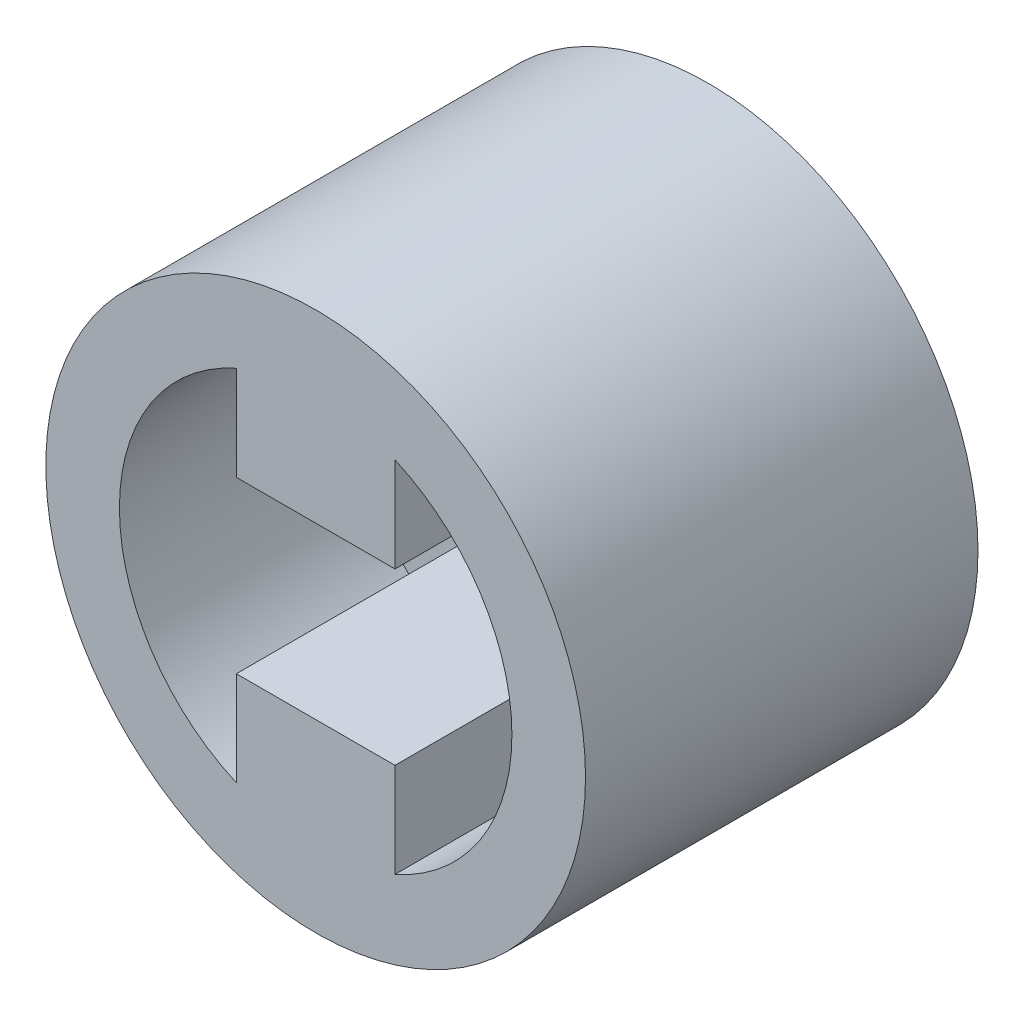
ISO-10303-21;
HEADER;
FILE_DESCRIPTION(('STEP AP214'),'2;1');
FILE_NAME('part.step','',(''),(''),'','','');
FILE_SCHEMA(('AUTOMOTIVE_DESIGN { 1 0 10303 214 1 1 1 1 }'));
ENDSEC;
DATA;
#1=APPLICATION_CONTEXT('core data for automotive mechanical design processes');
#2=APPLICATION_PROTOCOL_DEFINITION('international standard','automotive_design',2000,#1);
#3=PRODUCT_CONTEXT('',#1,'mechanical');
#4=PRODUCT('Part','Part','',(#3));
#5=PRODUCT_RELATED_PRODUCT_CATEGORY('part','',(#4));
#6=PRODUCT_DEFINITION_FORMATION('','',#4);
#7=PRODUCT_DEFINITION_CONTEXT('part definition',#1,'design');
#8=PRODUCT_DEFINITION('design','',#6,#7);
#9=PRODUCT_DEFINITION_SHAPE('','',#8);
#10=(LENGTH_UNIT() NAMED_UNIT(*) SI_UNIT(.MILLI.,.METRE.));
#11=(NAMED_UNIT(*) PLANE_ANGLE_UNIT() SI_UNIT($,.RADIAN.));
#12=(NAMED_UNIT(*) SI_UNIT($,.STERADIAN.) SOLID_ANGLE_UNIT());
#13=UNCERTAINTY_MEASURE_WITH_UNIT(LENGTH_MEASURE(1.E-05),#10,'distance_accuracy_value','');
#14=(GEOMETRIC_REPRESENTATION_CONTEXT(3) GLOBAL_UNCERTAINTY_ASSIGNED_CONTEXT((#13)) GLOBAL_UNIT_ASSIGNED_CONTEXT((#10,
#11,#12)) REPRESENTATION_CONTEXT('',''));
#15=CARTESIAN_POINT('',(0.,0.,0.));
#16=DIRECTION('',(0.,0.,1.));
#17=DIRECTION('',(1.,0.,0.));
#18=AXIS2_PLACEMENT_3D('',#15,#16,#17);
#19=CARTESIAN_POINT('',(0.,0.,12.));
#20=DIRECTION('',(0.,0.,1.));
#21=DIRECTION('',(1.,0.,0.));
#22=AXIS2_PLACEMENT_3D('',#19,#20,#21);
#23=PLANE('',#22);
#24=CARTESIAN_POINT('',(0.,0.,12.));
#25=DIRECTION('',(0.,0.,1.));
#26=DIRECTION('',(1.,0.,0.));
#27=AXIS2_PLACEMENT_3D('',#24,#25,#26);
#28=CIRCLE('',#27,8.25);
#29=CARTESIAN_POINT('',(8.25,0.,12.));
#30=VERTEX_POINT('',#29);
#31=EDGE_CURVE('E239',#30,#30,#28,.T.);
#32=ORIENTED_EDGE('',*,*,#31,.T.);
#33=EDGE_LOOP('',(#32));
#34=FACE_BOUND('',#33,.T.);
#35=CARTESIAN_POINT('',(0.,0.,12.));
#36=DIRECTION('',(0.,0.,1.));
#37=DIRECTION('',(1.,0.,0.));
#38=AXIS2_PLACEMENT_3D('',#35,#36,#37);
#39=CIRCLE('',#38,6.);
#40=CARTESIAN_POINT('',(-2.425,5.48811215264411,12.));
#41=VERTEX_POINT('',#40);
#42=CARTESIAN_POINT('',(-2.425,-5.48811215264411,12.));
#43=VERTEX_POINT('',#42);
#44=EDGE_CURVE('E203',#41,#43,#39,.T.);
#45=ORIENTED_EDGE('',*,*,#44,.F.);
#46=DIRECTION('',(0.,-1.,0.));
#47=VECTOR('',#46,1.);
#48=CARTESIAN_POINT('',(-2.425,0.,12.));
#49=LINE('',#48,#47);
#50=CARTESIAN_POINT('',(-2.425,2.6,12.));
#51=VERTEX_POINT('',#50);
#52=EDGE_CURVE('E172',#41,#51,#49,.T.);
#53=ORIENTED_EDGE('',*,*,#52,.T.);
#54=DIRECTION('',(1.,0.,0.));
#55=VECTOR('',#54,1.);
#56=CARTESIAN_POINT('',(0.,2.6,12.));
#57=LINE('',#56,#55);
#58=CARTESIAN_POINT('',(2.425,2.6,12.));
#59=VERTEX_POINT('',#58);
#60=EDGE_CURVE('E183',#51,#59,#57,.T.);
#61=ORIENTED_EDGE('',*,*,#60,.T.);
#62=DIRECTION('',(0.,-1.,0.));
#63=VECTOR('',#62,1.);
#64=CARTESIAN_POINT('',(2.425,0.,12.));
#65=LINE('',#64,#63);
#66=CARTESIAN_POINT('',(2.425,5.48811215264411,12.));
#67=VERTEX_POINT('',#66);
#68=EDGE_CURVE('E216',#67,#59,#65,.T.);
#69=ORIENTED_EDGE('',*,*,#68,.F.);
#70=CARTESIAN_POINT('',(2.425,-5.48811215264411,12.));
#71=VERTEX_POINT('',#70);
#72=EDGE_CURVE('E207',#71,#67,#39,.T.);
#73=ORIENTED_EDGE('',*,*,#72,.F.);
#74=DIRECTION('',(0.,-1.,0.));
#75=VECTOR('',#74,1.);
#76=CARTESIAN_POINT('',(2.425,0.,12.));
#77=LINE('',#76,#75);
#78=CARTESIAN_POINT('',(2.425,-2.6,12.));
#79=VERTEX_POINT('',#78);
#80=EDGE_CURVE('E213',#79,#71,#77,.T.);
#81=ORIENTED_EDGE('',*,*,#80,.F.);
#82=DIRECTION('',(1.,0.,0.));
#83=VECTOR('',#82,1.);
#84=CARTESIAN_POINT('',(0.,-2.6,12.));
#85=LINE('',#84,#83);
#86=CARTESIAN_POINT('',(-2.425,-2.6,12.));
#87=VERTEX_POINT('',#86);
#88=EDGE_CURVE('E210',#87,#79,#85,.T.);
#89=ORIENTED_EDGE('',*,*,#88,.F.);
#90=DIRECTION('',(0.,-1.,0.));
#91=VECTOR('',#90,1.);
#92=CARTESIAN_POINT('',(-2.425,0.,12.));
#93=LINE('',#92,#91);
#94=EDGE_CURVE('E206',#87,#43,#93,.T.);
#95=ORIENTED_EDGE('',*,*,#94,.T.);
#96=EDGE_LOOP('',(#45,#53,#61,#69,#73,#81,#89,#95));
#97=FACE_BOUND('',#96,.T.);
#98=ADVANCED_FACE('F39',(#34,#97),#23,.T.);
#99=CARTESIAN_POINT('',(0.,0.,12.));
#100=DIRECTION('',(0.,0.,-1.));
#101=DIRECTION('',(-1.,0.,0.));
#102=AXIS2_PLACEMENT_3D('',#99,#100,#101);
#103=CYLINDRICAL_SURFACE('',#102,8.25);
#104=ORIENTED_EDGE('',*,*,#31,.F.);
#105=EDGE_LOOP('',(#104));
#106=FACE_BOUND('',#105,.T.);
#107=CARTESIAN_POINT('',(0.,0.,0.));
#108=DIRECTION('',(0.,0.,1.));
#109=DIRECTION('',(1.,0.,0.));
#110=AXIS2_PLACEMENT_3D('',#107,#108,#109);
#111=CIRCLE('',#110,8.25);
#112=CARTESIAN_POINT('',(8.25,0.,0.));
#113=VERTEX_POINT('',#112);
#114=EDGE_CURVE('E224',#113,#113,#111,.T.);
#115=ORIENTED_EDGE('',*,*,#114,.T.);
#116=EDGE_LOOP('',(#115));
#117=FACE_BOUND('',#116,.T.);
#118=ADVANCED_FACE('F41',(#106,#117),#103,.T.);
#119=CARTESIAN_POINT('',(0.,0.,0.));
#120=DIRECTION('',(0.,0.,1.));
#121=DIRECTION('',(1.,0.,0.));
#122=AXIS2_PLACEMENT_3D('',#119,#120,#121);
#123=PLANE('',#122);
#124=DIRECTION('',(0.5,0.866025403784439,0.));
#125=VECTOR('',#124,1.);
#126=CARTESIAN_POINT('',(-2.3094010767585,0.,0.));
#127=LINE('',#126,#125);
#128=CARTESIAN_POINT('',(-2.3094010767585,0.,0.));
#129=VERTEX_POINT('',#128);
#130=CARTESIAN_POINT('',(-1.15470053837925,2.,0.));
#131=VERTEX_POINT('',#130);
#132=EDGE_CURVE('E151',#129,#131,#127,.T.);
#133=ORIENTED_EDGE('',*,*,#132,.F.);
#134=DIRECTION('',(-0.5,0.866025403784439,0.));
#135=VECTOR('',#134,1.);
#136=CARTESIAN_POINT('',(-1.15470053837925,-2.,0.));
#137=LINE('',#136,#135);
#138=CARTESIAN_POINT('',(-1.15470053837925,-2.,0.));
#139=VERTEX_POINT('',#138);
#140=EDGE_CURVE('E54',#139,#129,#137,.T.);
#141=ORIENTED_EDGE('',*,*,#140,.F.);
#142=DIRECTION('',(-1.,0.,0.));
#143=VECTOR('',#142,1.);
#144=CARTESIAN_POINT('',(1.15470053837925,-2.,0.));
#145=LINE('',#144,#143);
#146=CARTESIAN_POINT('',(1.15470053837925,-2.,0.));
#147=VERTEX_POINT('',#146);
#148=EDGE_CURVE('E167',#147,#139,#145,.T.);
#149=ORIENTED_EDGE('',*,*,#148,.F.);
#150=DIRECTION('',(-0.5,-0.866025403784439,0.));
#151=VECTOR('',#150,1.);
#152=CARTESIAN_POINT('',(2.3094010767585,0.,0.));
#153=LINE('',#152,#151);
#154=CARTESIAN_POINT('',(2.3094010767585,0.,0.));
#155=VERTEX_POINT('',#154);
#156=EDGE_CURVE('E161',#155,#147,#153,.T.);
#157=ORIENTED_EDGE('',*,*,#156,.F.);
#158=DIRECTION('',(0.5,-0.866025403784439,0.));
#159=VECTOR('',#158,1.);
#160=CARTESIAN_POINT('',(1.15470053837925,2.,0.));
#161=LINE('',#160,#159);
#162=CARTESIAN_POINT('',(1.15470053837925,2.,0.));
#163=VERTEX_POINT('',#162);
#164=EDGE_CURVE('E159',#163,#155,#161,.T.);
#165=ORIENTED_EDGE('',*,*,#164,.F.);
#166=DIRECTION('',(1.,0.,0.));
#167=VECTOR('',#166,1.);
#168=CARTESIAN_POINT('',(-1.15470053837925,2.,0.));
#169=LINE('',#168,#167);
#170=EDGE_CURVE('E142',#131,#163,#169,.T.);
#171=ORIENTED_EDGE('',*,*,#170,.F.);
#172=EDGE_LOOP('',(#133,#141,#149,#157,#165,#171));
#173=FACE_BOUND('',#172,.T.);
#174=ORIENTED_EDGE('',*,*,#114,.F.);
#175=EDGE_LOOP('',(#174));
#176=FACE_BOUND('',#175,.T.);
#177=ADVANCED_FACE('F155',(#173,#176),#123,.F.);
#178=CARTESIAN_POINT('',(-2.425,0.,5.));
#179=DIRECTION('',(-1.,0.,0.));
#180=DIRECTION('',(0.,0.,1.));
#181=AXIS2_PLACEMENT_3D('',#178,#179,#180);
#182=PLANE('',#181);
#183=ORIENTED_EDGE('',*,*,#52,.F.);
#184=DIRECTION('',(0.,0.,1.));
#185=VECTOR('',#184,1.);
#186=CARTESIAN_POINT('',(-2.425,5.48811215264411,5.));
#187=LINE('',#186,#185);
#188=CARTESIAN_POINT('',(-2.425,5.48811215264411,5.));
#189=VERTEX_POINT('',#188);
#190=EDGE_CURVE('E200',#189,#41,#187,.T.);
#191=ORIENTED_EDGE('',*,*,#190,.F.);
#192=DIRECTION('',(0.,-1.,0.));
#193=VECTOR('',#192,1.);
#194=CARTESIAN_POINT('',(-2.425,0.,5.));
#195=LINE('',#194,#193);
#196=CARTESIAN_POINT('',(-2.425,2.6,5.));
#197=VERTEX_POINT('',#196);
#198=EDGE_CURVE('E179',#189,#197,#195,.T.);
#199=ORIENTED_EDGE('',*,*,#198,.T.);
#200=DIRECTION('',(0.,0.,1.));
#201=VECTOR('',#200,1.);
#202=CARTESIAN_POINT('',(-2.425,2.6,5.));
#203=LINE('',#202,#201);
#204=EDGE_CURVE('E221',#197,#51,#203,.T.);
#205=ORIENTED_EDGE('',*,*,#204,.T.);
#206=EDGE_LOOP('',(#183,#191,#199,#205));
#207=FACE_BOUND('',#206,.T.);
#208=ADVANCED_FACE('F285',(#207),#182,.T.);
#209=CARTESIAN_POINT('',(0.,2.6,5.));
#210=DIRECTION('',(0.,-1.,0.));
#211=DIRECTION('',(0.,0.,-1.));
#212=AXIS2_PLACEMENT_3D('',#209,#210,#211);
#213=PLANE('',#212);
#214=ORIENTED_EDGE('',*,*,#60,.F.);
#215=ORIENTED_EDGE('',*,*,#204,.F.);
#216=DIRECTION('',(1.,0.,0.));
#217=VECTOR('',#216,1.);
#218=CARTESIAN_POINT('',(0.,2.6,5.));
#219=LINE('',#218,#217);
#220=CARTESIAN_POINT('',(2.425,2.6,5.));
#221=VERTEX_POINT('',#220);
#222=EDGE_CURVE('E198',#197,#221,#219,.T.);
#223=ORIENTED_EDGE('',*,*,#222,.T.);
#224=DIRECTION('',(0.,0.,1.));
#225=VECTOR('',#224,1.);
#226=CARTESIAN_POINT('',(2.425,2.6,5.));
#227=LINE('',#226,#225);
#228=EDGE_CURVE('E225',#221,#59,#227,.T.);
#229=ORIENTED_EDGE('',*,*,#228,.T.);
#230=EDGE_LOOP('',(#214,#215,#223,#229));
#231=FACE_BOUND('',#230,.T.);
#232=ADVANCED_FACE('F292',(#231),#213,.T.);
#233=CARTESIAN_POINT('',(2.425,0.,5.));
#234=DIRECTION('',(-1.,0.,0.));
#235=DIRECTION('',(0.,0.,1.));
#236=AXIS2_PLACEMENT_3D('',#233,#234,#235);
#237=PLANE('',#236);
#238=ORIENTED_EDGE('',*,*,#68,.T.);
#239=ORIENTED_EDGE('',*,*,#228,.F.);
#240=DIRECTION('',(0.,-1.,0.));
#241=VECTOR('',#240,1.);
#242=CARTESIAN_POINT('',(2.425,0.,5.));
#243=LINE('',#242,#241);
#244=CARTESIAN_POINT('',(2.425,5.48811215264411,5.));
#245=VERTEX_POINT('',#244);
#246=EDGE_CURVE('E195',#245,#221,#243,.T.);
#247=ORIENTED_EDGE('',*,*,#246,.F.);
#248=DIRECTION('',(0.,0.,1.));
#249=VECTOR('',#248,1.);
#250=CARTESIAN_POINT('',(2.425,5.48811215264411,5.));
#251=LINE('',#250,#249);
#252=EDGE_CURVE('E227',#245,#67,#251,.T.);
#253=ORIENTED_EDGE('',*,*,#252,.T.);
#254=EDGE_LOOP('',(#238,#239,#247,#253));
#255=FACE_BOUND('',#254,.T.);
#256=ADVANCED_FACE('F297',(#255),#237,.F.);
#257=CARTESIAN_POINT('',(0.,0.,5.));
#258=DIRECTION('',(0.,0.,1.));
#259=DIRECTION('',(1.,0.,0.));
#260=AXIS2_PLACEMENT_3D('',#257,#258,#259);
#261=CYLINDRICAL_SURFACE('',#260,6.);
#262=ORIENTED_EDGE('',*,*,#72,.T.);
#263=ORIENTED_EDGE('',*,*,#252,.F.);
#264=CARTESIAN_POINT('',(0.,0.,5.));
#265=DIRECTION('',(0.,0.,1.));
#266=DIRECTION('',(1.,0.,0.));
#267=AXIS2_PLACEMENT_3D('',#264,#265,#266);
#268=CIRCLE('',#267,6.);
#269=CARTESIAN_POINT('',(2.425,-5.48811215264411,5.));
#270=VERTEX_POINT('',#269);
#271=EDGE_CURVE('E187',#270,#245,#268,.T.);
#272=ORIENTED_EDGE('',*,*,#271,.F.);
#273=DIRECTION('',(0.,0.,1.));
#274=VECTOR('',#273,1.);
#275=CARTESIAN_POINT('',(2.425,-5.48811215264411,5.));
#276=LINE('',#275,#274);
#277=EDGE_CURVE('E229',#270,#71,#276,.T.);
#278=ORIENTED_EDGE('',*,*,#277,.T.);
#279=EDGE_LOOP('',(#262,#263,#272,#278));
#280=FACE_BOUND('',#279,.T.);
#281=ADVANCED_FACE('F323',(#280),#261,.F.);
#282=CARTESIAN_POINT('',(2.425,0.,5.));
#283=DIRECTION('',(-1.,0.,0.));
#284=DIRECTION('',(0.,0.,1.));
#285=AXIS2_PLACEMENT_3D('',#282,#283,#284);
#286=PLANE('',#285);
#287=ORIENTED_EDGE('',*,*,#80,.T.);
#288=ORIENTED_EDGE('',*,*,#277,.F.);
#289=DIRECTION('',(0.,-1.,0.));
#290=VECTOR('',#289,1.);
#291=CARTESIAN_POINT('',(2.425,0.,5.));
#292=LINE('',#291,#290);
#293=CARTESIAN_POINT('',(2.425,-2.6,5.));
#294=VERTEX_POINT('',#293);
#295=EDGE_CURVE('E192',#294,#270,#292,.T.);
#296=ORIENTED_EDGE('',*,*,#295,.F.);
#297=DIRECTION('',(0.,0.,1.));
#298=VECTOR('',#297,1.);
#299=CARTESIAN_POINT('',(2.425,-2.6,5.));
#300=LINE('',#299,#298);
#301=EDGE_CURVE('E231',#294,#79,#300,.T.);
#302=ORIENTED_EDGE('',*,*,#301,.T.);
#303=EDGE_LOOP('',(#287,#288,#296,#302));
#304=FACE_BOUND('',#303,.T.);
#305=ADVANCED_FACE('F326',(#304),#286,.F.);
#306=CARTESIAN_POINT('',(0.,-2.6,5.));
#307=DIRECTION('',(0.,-1.,0.));
#308=DIRECTION('',(0.,0.,-1.));
#309=AXIS2_PLACEMENT_3D('',#306,#307,#308);
#310=PLANE('',#309);
#311=ORIENTED_EDGE('',*,*,#88,.T.);
#312=ORIENTED_EDGE('',*,*,#301,.F.);
#313=DIRECTION('',(1.,0.,0.));
#314=VECTOR('',#313,1.);
#315=CARTESIAN_POINT('',(0.,-2.6,5.));
#316=LINE('',#315,#314);
#317=CARTESIAN_POINT('',(-2.425,-2.6,5.));
#318=VERTEX_POINT('',#317);
#319=EDGE_CURVE('E189',#318,#294,#316,.T.);
#320=ORIENTED_EDGE('',*,*,#319,.F.);
#321=DIRECTION('',(0.,0.,1.));
#322=VECTOR('',#321,1.);
#323=CARTESIAN_POINT('',(-2.425,-2.6,5.));
#324=LINE('',#323,#322);
#325=EDGE_CURVE('E233',#318,#87,#324,.T.);
#326=ORIENTED_EDGE('',*,*,#325,.T.);
#327=EDGE_LOOP('',(#311,#312,#320,#326));
#328=FACE_BOUND('',#327,.T.);
#329=ADVANCED_FACE('F328',(#328),#310,.F.);
#330=CARTESIAN_POINT('',(-2.425,0.,5.));
#331=DIRECTION('',(-1.,0.,0.));
#332=DIRECTION('',(0.,0.,1.));
#333=AXIS2_PLACEMENT_3D('',#330,#331,#332);
#334=PLANE('',#333);
#335=ORIENTED_EDGE('',*,*,#94,.F.);
#336=ORIENTED_EDGE('',*,*,#325,.F.);
#337=DIRECTION('',(0.,-1.,0.));
#338=VECTOR('',#337,1.);
#339=CARTESIAN_POINT('',(-2.425,0.,5.));
#340=LINE('',#339,#338);
#341=CARTESIAN_POINT('',(-2.425,-5.48811215264411,5.));
#342=VERTEX_POINT('',#341);
#343=EDGE_CURVE('E186',#318,#342,#340,.T.);
#344=ORIENTED_EDGE('',*,*,#343,.T.);
#345=DIRECTION('',(0.,0.,1.));
#346=VECTOR('',#345,1.);
#347=CARTESIAN_POINT('',(-2.425,-5.48811215264411,5.));
#348=LINE('',#347,#346);
#349=EDGE_CURVE('E235',#342,#43,#348,.T.);
#350=ORIENTED_EDGE('',*,*,#349,.T.);
#351=EDGE_LOOP('',(#335,#336,#344,#350));
#352=FACE_BOUND('',#351,.T.);
#353=ADVANCED_FACE('F311',(#352),#334,.T.);
#354=ORIENTED_EDGE('',*,*,#44,.T.);
#355=ORIENTED_EDGE('',*,*,#349,.F.);
#356=EDGE_CURVE('E182',#189,#342,#268,.T.);
#357=ORIENTED_EDGE('',*,*,#356,.F.);
#358=ORIENTED_EDGE('',*,*,#190,.T.);
#359=EDGE_LOOP('',(#354,#355,#357,#358));
#360=FACE_BOUND('',#359,.T.);
#361=ADVANCED_FACE('F305',(#360),#261,.F.);
#362=CARTESIAN_POINT('',(0.,0.,5.));
#363=DIRECTION('',(0.,0.,1.));
#364=DIRECTION('',(1.,0.,0.));
#365=AXIS2_PLACEMENT_3D('',#362,#363,#364);
#366=PLANE('',#365);
#367=DIRECTION('',(0.5,-0.866025403784439,0.));
#368=VECTOR('',#367,1.);
#369=CARTESIAN_POINT('',(-1.73205080756888,-0.999999999999999,5.));
#370=LINE('',#369,#368);
#371=CARTESIAN_POINT('',(-2.3094010767585,0.,5.));
#372=VERTEX_POINT('',#371);
#373=CARTESIAN_POINT('',(-1.15470053837925,-2.,5.));
#374=VERTEX_POINT('',#373);
#375=EDGE_CURVE('E11',#372,#374,#370,.T.);
#376=ORIENTED_EDGE('',*,*,#375,.F.);
#377=DIRECTION('',(-0.5,-0.866025403784439,0.));
#378=VECTOR('',#377,1.);
#379=CARTESIAN_POINT('',(-1.73205080756888,1.,5.));
#380=LINE('',#379,#378);
#381=CARTESIAN_POINT('',(-1.15470053837925,2.,5.));
#382=VERTEX_POINT('',#381);
#383=EDGE_CURVE('E242',#382,#372,#380,.T.);
#384=ORIENTED_EDGE('',*,*,#383,.F.);
#385=DIRECTION('',(-1.,0.,0.));
#386=VECTOR('',#385,1.);
#387=CARTESIAN_POINT('',(0.,2.,5.));
#388=LINE('',#387,#386);
#389=CARTESIAN_POINT('',(1.15470053837925,2.,5.));
#390=VERTEX_POINT('',#389);
#391=EDGE_CURVE('E145',#390,#382,#388,.T.);
#392=ORIENTED_EDGE('',*,*,#391,.F.);
#393=DIRECTION('',(-0.5,0.866025403784439,0.));
#394=VECTOR('',#393,1.);
#395=CARTESIAN_POINT('',(1.73205080756888,1.,5.));
#396=LINE('',#395,#394);
#397=CARTESIAN_POINT('',(2.3094010767585,0.,5.));
#398=VERTEX_POINT('',#397);
#399=EDGE_CURVE('E247',#398,#390,#396,.T.);
#400=ORIENTED_EDGE('',*,*,#399,.F.);
#401=DIRECTION('',(0.5,0.866025403784439,0.));
#402=VECTOR('',#401,1.);
#403=CARTESIAN_POINT('',(1.73205080756888,-1.,5.));
#404=LINE('',#403,#402);
#405=CARTESIAN_POINT('',(1.15470053837925,-2.,5.));
#406=VERTEX_POINT('',#405);
#407=EDGE_CURVE('E249',#406,#398,#404,.T.);
#408=ORIENTED_EDGE('',*,*,#407,.F.);
#409=DIRECTION('',(1.,0.,0.));
#410=VECTOR('',#409,1.);
#411=CARTESIAN_POINT('',(0.,-2.,5.));
#412=LINE('',#411,#410);
#413=EDGE_CURVE('E47',#374,#406,#412,.T.);
#414=ORIENTED_EDGE('',*,*,#413,.F.);
#415=EDGE_LOOP('',(#376,#384,#392,#400,#408,#414));
#416=FACE_BOUND('',#415,.T.);
#417=ORIENTED_EDGE('',*,*,#198,.F.);
#418=ORIENTED_EDGE('',*,*,#356,.T.);
#419=ORIENTED_EDGE('',*,*,#343,.F.);
#420=ORIENTED_EDGE('',*,*,#319,.T.);
#421=ORIENTED_EDGE('',*,*,#295,.T.);
#422=ORIENTED_EDGE('',*,*,#271,.T.);
#423=ORIENTED_EDGE('',*,*,#246,.T.);
#424=ORIENTED_EDGE('',*,*,#222,.F.);
#425=EDGE_LOOP('',(#417,#418,#419,#420,#421,#422,#423,#424));
#426=FACE_BOUND('',#425,.T.);
#427=ADVANCED_FACE('F263',(#416,#426),#366,.T.);
#428=CARTESIAN_POINT('',(-1.15470053837925,-2.,12.));
#429=DIRECTION('',(-0.866025403784439,-0.5,0.));
#430=DIRECTION('',(0.5,-0.866025403784439,0.));
#431=AXIS2_PLACEMENT_3D('',#428,#429,#430);
#432=PLANE('',#431);
#433=ORIENTED_EDGE('',*,*,#375,.T.);
#434=DIRECTION('',(0.,0.,-1.));
#435=VECTOR('',#434,1.);
#436=CARTESIAN_POINT('',(-1.15470053837925,-2.,12.));
#437=LINE('',#436,#435);
#438=EDGE_CURVE('E170',#374,#139,#437,.T.);
#439=ORIENTED_EDGE('',*,*,#438,.T.);
#440=ORIENTED_EDGE('',*,*,#140,.T.);
#441=DIRECTION('',(0.,0.,-1.));
#442=VECTOR('',#441,1.);
#443=CARTESIAN_POINT('',(-2.3094010767585,0.,12.));
#444=LINE('',#443,#442);
#445=EDGE_CURVE('E148',#372,#129,#444,.T.);
#446=ORIENTED_EDGE('',*,*,#445,.F.);
#447=EDGE_LOOP('',(#433,#439,#440,#446));
#448=FACE_BOUND('',#447,.T.);
#449=ADVANCED_FACE('F342',(#448),#432,.F.);
#450=CARTESIAN_POINT('',(1.15470053837925,-2.,12.));
#451=DIRECTION('',(0.,-1.,0.));
#452=DIRECTION('',(1.,0.,0.));
#453=AXIS2_PLACEMENT_3D('',#450,#451,#452);
#454=PLANE('',#453);
#455=ORIENTED_EDGE('',*,*,#413,.T.);
#456=DIRECTION('',(0.,0.,-1.));
#457=VECTOR('',#456,1.);
#458=CARTESIAN_POINT('',(1.15470053837925,-2.,12.));
#459=LINE('',#458,#457);
#460=EDGE_CURVE('E173',#406,#147,#459,.T.);
#461=ORIENTED_EDGE('',*,*,#460,.T.);
#462=ORIENTED_EDGE('',*,*,#148,.T.);
#463=ORIENTED_EDGE('',*,*,#438,.F.);
#464=EDGE_LOOP('',(#455,#461,#462,#463));
#465=FACE_BOUND('',#464,.T.);
#466=ADVANCED_FACE('F254',(#465),#454,.F.);
#467=CARTESIAN_POINT('',(2.3094010767585,0.,12.));
#468=DIRECTION('',(0.866025403784439,-0.5,0.));
#469=DIRECTION('',(0.5,0.866025403784439,0.));
#470=AXIS2_PLACEMENT_3D('',#467,#468,#469);
#471=PLANE('',#470);
#472=ORIENTED_EDGE('',*,*,#407,.T.);
#473=DIRECTION('',(0.,0.,-1.));
#474=VECTOR('',#473,1.);
#475=CARTESIAN_POINT('',(2.3094010767585,0.,12.));
#476=LINE('',#475,#474);
#477=EDGE_CURVE('E175',#398,#155,#476,.T.);
#478=ORIENTED_EDGE('',*,*,#477,.T.);
#479=ORIENTED_EDGE('',*,*,#156,.T.);
#480=ORIENTED_EDGE('',*,*,#460,.F.);
#481=EDGE_LOOP('',(#472,#478,#479,#480));
#482=FACE_BOUND('',#481,.T.);
#483=ADVANCED_FACE('F259',(#482),#471,.F.);
#484=CARTESIAN_POINT('',(1.15470053837925,2.,12.));
#485=DIRECTION('',(0.866025403784439,0.5,0.));
#486=DIRECTION('',(-0.5,0.866025403784439,0.));
#487=AXIS2_PLACEMENT_3D('',#484,#485,#486);
#488=PLANE('',#487);
#489=ORIENTED_EDGE('',*,*,#399,.T.);
#490=DIRECTION('',(0.,0.,-1.));
#491=VECTOR('',#490,1.);
#492=CARTESIAN_POINT('',(1.15470053837925,2.,12.));
#493=LINE('',#492,#491);
#494=EDGE_CURVE('E147',#390,#163,#493,.T.);
#495=ORIENTED_EDGE('',*,*,#494,.T.);
#496=ORIENTED_EDGE('',*,*,#164,.T.);
#497=ORIENTED_EDGE('',*,*,#477,.F.);
#498=EDGE_LOOP('',(#489,#495,#496,#497));
#499=FACE_BOUND('',#498,.T.);
#500=ADVANCED_FACE('F266',(#499),#488,.F.);
#501=CARTESIAN_POINT('',(-1.15470053837925,2.,12.));
#502=DIRECTION('',(0.,1.,0.));
#503=DIRECTION('',(-1.,0.,0.));
#504=AXIS2_PLACEMENT_3D('',#501,#502,#503);
#505=PLANE('',#504);
#506=ORIENTED_EDGE('',*,*,#391,.T.);
#507=DIRECTION('',(0.,0.,-1.));
#508=VECTOR('',#507,1.);
#509=CARTESIAN_POINT('',(-1.15470053837925,2.,12.));
#510=LINE('',#509,#508);
#511=EDGE_CURVE('E62',#382,#131,#510,.T.);
#512=ORIENTED_EDGE('',*,*,#511,.T.);
#513=ORIENTED_EDGE('',*,*,#170,.T.);
#514=ORIENTED_EDGE('',*,*,#494,.F.);
#515=EDGE_LOOP('',(#506,#512,#513,#514));
#516=FACE_BOUND('',#515,.T.);
#517=ADVANCED_FACE('F139',(#516),#505,.F.);
#518=CARTESIAN_POINT('',(-2.3094010767585,0.,12.));
#519=DIRECTION('',(-0.866025403784439,0.5,0.));
#520=DIRECTION('',(-0.5,-0.866025403784439,0.));
#521=AXIS2_PLACEMENT_3D('',#518,#519,#520);
#522=PLANE('',#521);
#523=ORIENTED_EDGE('',*,*,#383,.T.);
#524=ORIENTED_EDGE('',*,*,#445,.T.);
#525=ORIENTED_EDGE('',*,*,#132,.T.);
#526=ORIENTED_EDGE('',*,*,#511,.F.);
#527=EDGE_LOOP('',(#523,#524,#525,#526));
#528=FACE_BOUND('',#527,.T.);
#529=ADVANCED_FACE('F152',(#528),#522,.F.);
#530=CLOSED_SHELL('',(#98,#118,#177,#208,#232,#256,#281,#305,#329,#353,#361,#427,#449,#466,#483,
#500,#517,#529));
#531=MANIFOLD_SOLID_BREP('B2',#530);
#532=ADVANCED_BREP_SHAPE_REPRESENTATION('',(#18,#531),#14);
#533=SHAPE_DEFINITION_REPRESENTATION(#9,#532);
ENDSEC;
END-ISO-10303-21;
